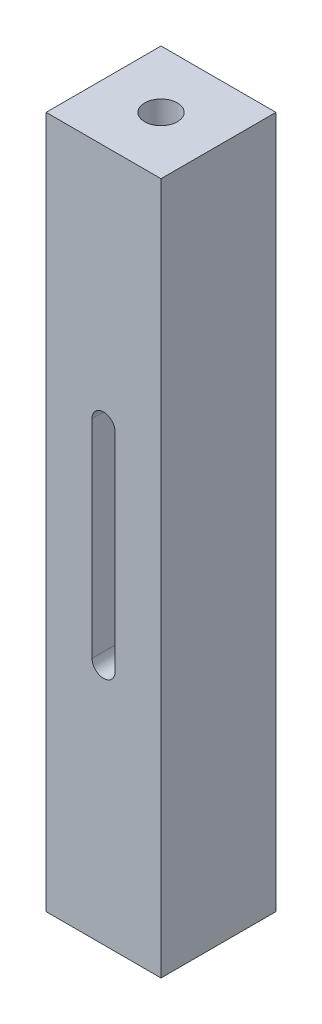
ISO-10303-21;
HEADER;
FILE_DESCRIPTION(('STEP AP214'),'2;1');
FILE_NAME('part.step','',(''),(''),'','','');
FILE_SCHEMA(('AUTOMOTIVE_DESIGN { 1 0 10303 214 1 1 1 1 }'));
ENDSEC;
DATA;
#1=APPLICATION_CONTEXT('core data for automotive mechanical design processes');
#2=APPLICATION_PROTOCOL_DEFINITION('international standard','automotive_design',2000,#1);
#3=PRODUCT_CONTEXT('',#1,'mechanical');
#4=PRODUCT('Part','Part','',(#3));
#5=PRODUCT_RELATED_PRODUCT_CATEGORY('part','',(#4));
#6=PRODUCT_DEFINITION_FORMATION('','',#4);
#7=PRODUCT_DEFINITION_CONTEXT('part definition',#1,'design');
#8=PRODUCT_DEFINITION('design','',#6,#7);
#9=PRODUCT_DEFINITION_SHAPE('','',#8);
#10=(LENGTH_UNIT() NAMED_UNIT(*) SI_UNIT(.MILLI.,.METRE.));
#11=(NAMED_UNIT(*) PLANE_ANGLE_UNIT() SI_UNIT($,.RADIAN.));
#12=(NAMED_UNIT(*) SI_UNIT($,.STERADIAN.) SOLID_ANGLE_UNIT());
#13=UNCERTAINTY_MEASURE_WITH_UNIT(LENGTH_MEASURE(1.E-05),#10,'distance_accuracy_value','');
#14=(GEOMETRIC_REPRESENTATION_CONTEXT(3) GLOBAL_UNCERTAINTY_ASSIGNED_CONTEXT((#13)) GLOBAL_UNIT_ASSIGNED_CONTEXT((#10,
#11,#12)) REPRESENTATION_CONTEXT('',''));
#15=CARTESIAN_POINT('',(0.,0.,0.));
#16=DIRECTION('',(0.,0.,1.));
#17=DIRECTION('',(1.,0.,0.));
#18=AXIS2_PLACEMENT_3D('',#15,#16,#17);
#19=CARTESIAN_POINT('',(0.,150.,0.));
#20=DIRECTION('',(0.,0.,-1.));
#21=DIRECTION('',(-1.,0.,0.));
#22=AXIS2_PLACEMENT_3D('',#19,#20,#21);
#23=PLANE('',#22);
#24=DIRECTION('',(1.,0.,0.));
#25=VECTOR('',#24,1.);
#26=CARTESIAN_POINT('',(0.,0.,0.));
#27=LINE('',#26,#25);
#28=CARTESIAN_POINT('',(-24.9,0.,0.));
#29=VERTEX_POINT('',#28);
#30=CARTESIAN_POINT('',(0.,0.,0.));
#31=VERTEX_POINT('',#30);
#32=EDGE_CURVE('E204',#29,#31,#27,.T.);
#33=ORIENTED_EDGE('',*,*,#32,.T.);
#34=DIRECTION('',(0.,-1.,0.));
#35=VECTOR('',#34,1.);
#36=CARTESIAN_POINT('',(0.,150.,0.));
#37=LINE('',#36,#35);
#38=CARTESIAN_POINT('',(0.,150.,0.));
#39=VERTEX_POINT('',#38);
#40=EDGE_CURVE('E213',#39,#31,#37,.T.);
#41=ORIENTED_EDGE('',*,*,#40,.F.);
#42=DIRECTION('',(1.,0.,0.));
#43=VECTOR('',#42,1.);
#44=CARTESIAN_POINT('',(0.,150.,0.));
#45=LINE('',#44,#43);
#46=CARTESIAN_POINT('',(-24.9,150.,0.));
#47=VERTEX_POINT('',#46);
#48=EDGE_CURVE('E217',#47,#39,#45,.T.);
#49=ORIENTED_EDGE('',*,*,#48,.F.);
#50=DIRECTION('',(0.,-1.,0.));
#51=VECTOR('',#50,1.);
#52=CARTESIAN_POINT('',(-24.9,150.,0.));
#53=LINE('',#52,#51);
#54=EDGE_CURVE('E201',#47,#29,#53,.T.);
#55=ORIENTED_EDGE('',*,*,#54,.T.);
#56=EDGE_LOOP('',(#33,#41,#49,#55));
#57=FACE_BOUND('',#56,.T.);
#58=CARTESIAN_POINT('',(-12.45,52.5,0.));
#59=DIRECTION('',(0.,0.,1.));
#60=DIRECTION('',(1.,0.,0.));
#61=AXIS2_PLACEMENT_3D('',#58,#59,#60);
#62=CIRCLE('',#61,2.5);
#63=CARTESIAN_POINT('',(-14.95,52.5,0.));
#64=VERTEX_POINT('',#63);
#65=CARTESIAN_POINT('',(-9.95,52.5,0.));
#66=VERTEX_POINT('',#65);
#67=EDGE_CURVE('E125',#64,#66,#62,.T.);
#68=ORIENTED_EDGE('',*,*,#67,.F.);
#69=DIRECTION('',(0.,-1.,0.));
#70=VECTOR('',#69,1.);
#71=CARTESIAN_POINT('',(-14.95,97.5,0.));
#72=LINE('',#71,#70);
#73=CARTESIAN_POINT('',(-14.95,97.5,0.));
#74=VERTEX_POINT('',#73);
#75=EDGE_CURVE('E261',#74,#64,#72,.T.);
#76=ORIENTED_EDGE('',*,*,#75,.F.);
#77=CARTESIAN_POINT('',(-12.45,97.5,0.));
#78=DIRECTION('',(0.,0.,-1.));
#79=DIRECTION('',(-1.,0.,0.));
#80=AXIS2_PLACEMENT_3D('',#77,#78,#79);
#81=CIRCLE('',#80,2.5);
#82=CARTESIAN_POINT('',(-9.95,97.5,0.));
#83=VERTEX_POINT('',#82);
#84=EDGE_CURVE('E156',#74,#83,#81,.T.);
#85=ORIENTED_EDGE('',*,*,#84,.T.);
#86=DIRECTION('',(0.,-1.,0.));
#87=VECTOR('',#86,1.);
#88=CARTESIAN_POINT('',(-9.95,97.5,0.));
#89=LINE('',#88,#87);
#90=EDGE_CURVE('E59',#83,#66,#89,.T.);
#91=ORIENTED_EDGE('',*,*,#90,.T.);
#92=EDGE_LOOP('',(#68,#76,#85,#91));
#93=FACE_BOUND('',#92,.T.);
#94=ADVANCED_FACE('F43',(#57,#93),#23,.F.);
#95=CARTESIAN_POINT('',(0.,150.,0.));
#96=DIRECTION('',(0.,1.,0.));
#97=DIRECTION('',(0.,0.,1.));
#98=AXIS2_PLACEMENT_3D('',#95,#96,#97);
#99=PLANE('',#98);
#100=DIRECTION('',(0.,0.,-1.));
#101=VECTOR('',#100,1.);
#102=CARTESIAN_POINT('',(0.,150.,0.));
#103=LINE('',#102,#101);
#104=CARTESIAN_POINT('',(0.,150.,-24.9));
#105=VERTEX_POINT('',#104);
#106=EDGE_CURVE('E209',#39,#105,#103,.T.);
#107=ORIENTED_EDGE('',*,*,#106,.T.);
#108=DIRECTION('',(-1.,0.,0.));
#109=VECTOR('',#108,1.);
#110=CARTESIAN_POINT('',(0.,150.,-24.9));
#111=LINE('',#110,#109);
#112=CARTESIAN_POINT('',(-24.9,150.,-24.9));
#113=VERTEX_POINT('',#112);
#114=EDGE_CURVE('E229',#105,#113,#111,.T.);
#115=ORIENTED_EDGE('',*,*,#114,.T.);
#116=DIRECTION('',(0.,0.,1.));
#117=VECTOR('',#116,1.);
#118=CARTESIAN_POINT('',(-24.9,150.,0.));
#119=LINE('',#118,#117);
#120=EDGE_CURVE('E199',#113,#47,#119,.T.);
#121=ORIENTED_EDGE('',*,*,#120,.T.);
#122=ORIENTED_EDGE('',*,*,#48,.T.);
#123=EDGE_LOOP('',(#107,#115,#121,#122));
#124=FACE_BOUND('',#123,.T.);
#125=CARTESIAN_POINT('',(-12.45,150.,-12.45));
#126=DIRECTION('',(0.,1.,0.));
#127=DIRECTION('',(0.,0.,1.));
#128=AXIS2_PLACEMENT_3D('',#125,#126,#127);
#129=CIRCLE('',#128,3.55);
#130=CARTESIAN_POINT('',(-12.45,150.,-8.9));
#131=VERTEX_POINT('',#130);
#132=EDGE_CURVE('E233',#131,#131,#129,.T.);
#133=ORIENTED_EDGE('',*,*,#132,.F.);
#134=EDGE_LOOP('',(#133));
#135=FACE_BOUND('',#134,.T.);
#136=ADVANCED_FACE('F165',(#124,#135),#99,.T.);
#137=CARTESIAN_POINT('',(0.,0.,0.));
#138=DIRECTION('',(0.,1.,0.));
#139=DIRECTION('',(0.,0.,1.));
#140=AXIS2_PLACEMENT_3D('',#137,#138,#139);
#141=PLANE('',#140);
#142=DIRECTION('',(0.,0.,-1.));
#143=VECTOR('',#142,1.);
#144=CARTESIAN_POINT('',(0.,0.,0.));
#145=LINE('',#144,#143);
#146=CARTESIAN_POINT('',(0.,0.,-24.9));
#147=VERTEX_POINT('',#146);
#148=EDGE_CURVE('E195',#31,#147,#145,.T.);
#149=ORIENTED_EDGE('',*,*,#148,.F.);
#150=ORIENTED_EDGE('',*,*,#32,.F.);
#151=DIRECTION('',(0.,0.,1.));
#152=VECTOR('',#151,1.);
#153=CARTESIAN_POINT('',(-24.9,0.,0.));
#154=LINE('',#153,#152);
#155=CARTESIAN_POINT('',(-24.9,0.,-24.9));
#156=VERTEX_POINT('',#155);
#157=EDGE_CURVE('E194',#156,#29,#154,.T.);
#158=ORIENTED_EDGE('',*,*,#157,.F.);
#159=DIRECTION('',(-1.,0.,0.));
#160=VECTOR('',#159,1.);
#161=CARTESIAN_POINT('',(0.,0.,-24.9));
#162=LINE('',#161,#160);
#163=EDGE_CURVE('E186',#147,#156,#162,.T.);
#164=ORIENTED_EDGE('',*,*,#163,.F.);
#165=EDGE_LOOP('',(#149,#150,#158,#164));
#166=FACE_BOUND('',#165,.T.);
#167=CARTESIAN_POINT('',(-12.45,0.,-12.45));
#168=DIRECTION('',(0.,1.,0.));
#169=DIRECTION('',(0.,0.,1.));
#170=AXIS2_PLACEMENT_3D('',#167,#168,#169);
#171=CIRCLE('',#170,3.55);
#172=CARTESIAN_POINT('',(-12.45,0.,-8.9));
#173=VERTEX_POINT('',#172);
#174=EDGE_CURVE('E237',#173,#173,#171,.T.);
#175=ORIENTED_EDGE('',*,*,#174,.T.);
#176=EDGE_LOOP('',(#175));
#177=FACE_BOUND('',#176,.T.);
#178=ADVANCED_FACE('F168',(#166,#177),#141,.F.);
#179=CARTESIAN_POINT('',(0.,150.,0.));
#180=DIRECTION('',(-1.,0.,0.));
#181=DIRECTION('',(0.,0.,1.));
#182=AXIS2_PLACEMENT_3D('',#179,#180,#181);
#183=PLANE('',#182);
#184=ORIENTED_EDGE('',*,*,#148,.T.);
#185=DIRECTION('',(0.,-1.,0.));
#186=VECTOR('',#185,1.);
#187=CARTESIAN_POINT('',(0.,150.,-24.9));
#188=LINE('',#187,#186);
#189=EDGE_CURVE('E11',#105,#147,#188,.T.);
#190=ORIENTED_EDGE('',*,*,#189,.F.);
#191=ORIENTED_EDGE('',*,*,#106,.F.);
#192=ORIENTED_EDGE('',*,*,#40,.T.);
#193=EDGE_LOOP('',(#184,#190,#191,#192));
#194=FACE_BOUND('',#193,.T.);
#195=ADVANCED_FACE('F45',(#194),#183,.F.);
#196=CARTESIAN_POINT('',(0.,150.,-24.9));
#197=DIRECTION('',(0.,0.,1.));
#198=DIRECTION('',(1.,0.,0.));
#199=AXIS2_PLACEMENT_3D('',#196,#197,#198);
#200=PLANE('',#199);
#201=ORIENTED_EDGE('',*,*,#163,.T.);
#202=DIRECTION('',(0.,-1.,0.));
#203=VECTOR('',#202,1.);
#204=CARTESIAN_POINT('',(-24.9,150.,-24.9));
#205=LINE('',#204,#203);
#206=EDGE_CURVE('E52',#113,#156,#205,.T.);
#207=ORIENTED_EDGE('',*,*,#206,.F.);
#208=ORIENTED_EDGE('',*,*,#114,.F.);
#209=ORIENTED_EDGE('',*,*,#189,.T.);
#210=EDGE_LOOP('',(#201,#207,#208,#209));
#211=FACE_BOUND('',#210,.T.);
#212=ADVANCED_FACE('F177',(#211),#200,.F.);
#213=CARTESIAN_POINT('',(-24.9,150.,0.));
#214=DIRECTION('',(1.,0.,0.));
#215=DIRECTION('',(0.,0.,-1.));
#216=AXIS2_PLACEMENT_3D('',#213,#214,#215);
#217=PLANE('',#216);
#218=ORIENTED_EDGE('',*,*,#157,.T.);
#219=ORIENTED_EDGE('',*,*,#54,.F.);
#220=ORIENTED_EDGE('',*,*,#120,.F.);
#221=ORIENTED_EDGE('',*,*,#206,.T.);
#222=EDGE_LOOP('',(#218,#219,#220,#221));
#223=FACE_BOUND('',#222,.T.);
#224=ADVANCED_FACE('F164',(#223),#217,.F.);
#225=CARTESIAN_POINT('',(-12.45,150.,-12.45));
#226=DIRECTION('',(0.,-1.,0.));
#227=DIRECTION('',(0.,0.,-1.));
#228=AXIS2_PLACEMENT_3D('',#225,#226,#227);
#229=CYLINDRICAL_SURFACE('',#228,3.55);
#230=DIRECTION('',(0.,-1.,0.));
#231=VECTOR('',#230,1.);
#232=CARTESIAN_POINT('',(-14.95,150.,-9.92958336777428));
#233=LINE('',#232,#231);
#234=CARTESIAN_POINT('',(-14.95,97.5,-9.92958336777428));
#235=VERTEX_POINT('',#234);
#236=CARTESIAN_POINT('',(-14.95,52.5,-9.92958336777428));
#237=VERTEX_POINT('',#236);
#238=EDGE_CURVE('E132',#235,#237,#233,.T.);
#239=ORIENTED_EDGE('',*,*,#238,.T.);
#240=CARTESIAN_POINT('',(-14.95,52.5,-9.92958336777428));
#241=CARTESIAN_POINT('',(-14.9500172955895,52.4396410473149,-9.92962243143256));
#242=CARTESIAN_POINT('',(-14.9478148936106,52.3793074114605,-9.92741616371839));
#243=CARTESIAN_POINT('',(-14.9391109248143,52.2593465395515,-9.91881585708524));
#244=CARTESIAN_POINT('',(-14.9326163278174,52.1997183175408,-9.91242860755494));
#245=CARTESIAN_POINT('',(-14.9155625657586,52.0822803468996,-9.89585990559607));
#246=CARTESIAN_POINT('',(-14.9050493210102,52.024457759607,-9.88572135898051));
#247=CARTESIAN_POINT('',(-14.8801672617943,51.9103385314542,-9.86212773492245));
#248=CARTESIAN_POINT('',(-14.8657970534636,51.8540424503702,-9.84867145863325));
#249=CARTESIAN_POINT('',(-14.8174435364751,51.6886181915408,-9.80432240452607));
#250=CARTESIAN_POINT('',(-14.7780907875172,51.5821178372995,-9.76931772380717));
#251=CARTESIAN_POINT('',(-14.6865222308671,51.3772184560647,-9.69245572583047));
#252=CARTESIAN_POINT('',(-14.6342652832461,51.2788467094263,-9.65057663827893));
#253=CARTESIAN_POINT('',(-14.507716043449,51.0742740673846,-9.555939942336));
#254=CARTESIAN_POINT('',(-14.4311630782887,50.9697510187705,-9.50256620542888));
#255=CARTESIAN_POINT('',(-14.2628210466401,50.7736119902543,-9.39612689485723));
#256=CARTESIAN_POINT('',(-14.1710237429709,50.6820030381513,-9.34306150393759));
#257=CARTESIAN_POINT('',(-13.9558815326285,50.4986317582468,-9.23258729267795));
#258=CARTESIAN_POINT('',(-13.8298265366432,50.4094854829168,-9.17597130499123));
#259=CARTESIAN_POINT('',(-13.6275400937733,50.2933166170076,-9.10020746085601));
#260=CARTESIAN_POINT('',(-13.5579250556764,50.2575238711768,-9.07648316223));
#261=CARTESIAN_POINT('',(-13.4146843393017,50.1922793970561,-9.03276648889678));
#262=CARTESIAN_POINT('',(-13.3410604552212,50.1628248607987,-9.01277246212059));
#263=CARTESIAN_POINT('',(-13.1560298548026,50.0989686204796,-8.96909763198269));
#264=CARTESIAN_POINT('',(-13.0426653642865,50.0684073667012,-8.94787435142497));
#265=CARTESIAN_POINT('',(-12.8113592967104,50.0234527656321,-8.91651359543244));
#266=CARTESIAN_POINT('',(-12.6934215501939,50.0090461774641,-8.90636704134137));
#267=CARTESIAN_POINT('',(-12.456016023374,49.9971796063026,-8.89801593705122));
#268=CARTESIAN_POINT('',(-12.3365456588244,49.9997535087723,-8.89983526537855));
#269=CARTESIAN_POINT('',(-12.0999488378241,50.0217765802728,-8.91531027909572));
#270=CARTESIAN_POINT('',(-11.9828230461075,50.041230467691,-8.92896927397398));
#271=CARTESIAN_POINT('',(-11.7569003788532,50.0952558448953,-8.96647756250765));
#272=CARTESIAN_POINT('',(-11.6479717814065,50.1294574551676,-8.99007722444064));
#273=CARTESIAN_POINT('',(-11.4376472255329,50.2113557469459,-9.04566596087549));
#274=CARTESIAN_POINT('',(-11.3362526935516,50.2590549758155,-9.07765661890058));
#275=CARTESIAN_POINT('',(-11.1315309103145,50.3723664359245,-9.15192685022707));
#276=CARTESIAN_POINT('',(-11.0292603970579,50.4393870395104,-9.19495768785188));
#277=CARTESIAN_POINT('',(-10.8367966018301,50.5862966780128,-9.28591543120471));
#278=CARTESIAN_POINT('',(-10.7466162819656,50.6661993250843,-9.33384749613069));
#279=CARTESIAN_POINT('',(-10.5639298780979,50.8529539629837,-9.44029580443247));
#280=CARTESIAN_POINT('',(-10.4739338385023,50.9620675740698,-9.49916268562961));
#281=CARTESIAN_POINT('',(-10.3128604447879,51.1951276962468,-9.61364985150114));
#282=CARTESIAN_POINT('',(-10.2417840823167,51.3190749843302,-9.66926996588166));
#283=CARTESIAN_POINT('',(-10.134535613703,51.5508046579356,-9.75837847751746));
#284=CARTESIAN_POINT('',(-10.0940970843391,51.6557773097046,-9.79401730693604));
#285=CARTESIAN_POINT('',(-10.0273213578474,51.8727747938097,-9.85477729382108));
#286=CARTESIAN_POINT('',(-10.0009292990344,51.9847702509084,-9.87993928582028));
#287=CARTESIAN_POINT('',(-9.97169067267033,52.1647273551852,-9.9082078029388));
#288=CARTESIAN_POINT('',(-9.96360307675327,52.2311144232213,-9.91614376063475));
#289=CARTESIAN_POINT('',(-9.95273783589632,52.3649767538164,-9.92686683735443));
#290=CARTESIAN_POINT('',(-9.9499800028894,52.4324551398959,-9.92963474428004));
#291=CARTESIAN_POINT('',(-9.95,52.5,-9.92958336777428));
#292=B_SPLINE_CURVE_WITH_KNOTS('',3,(#240,#241,#242,#243,#244,#245,#246,#247,#248,#249,#250,
#251,#252,#253,#254,#255,#256,#257,#258,#259,#260,#261,#262,#263,#264,#265,#266,#267,#268,#269,
#270,#271,#272,#273,#274,#275,#276,#277,#278,#279,#280,#281,#282,#283,#284,#285,#286,#287,#288,
#289,#290,#291),.UNSPECIFIED.,.F.,.F.,(4,2,2,2,2,2,2,2,2,2,2,2,2,2,2,2,2,2,2,2,2,2,2,2,2,4),(0.,
0.180955696338622,0.361618269933722,0.540275342640234,0.71899706713246,1.07390598770652,
1.42996134325616,1.84879675566998,2.2678592239332,2.75808963516233,3.00311204522661,
3.24802568041549,3.60430312175796,3.960288332853,4.31698414576527,4.67377969640884,
5.02210439434048,5.37049487440307,5.75792703730426,6.14577130678903,6.6035155000332,
7.0612836805595,7.41409254239013,7.765513124328,7.96717046646382,8.16957598348976),.UNSPECIFIED.);
#293=CARTESIAN_POINT('',(-9.95,52.5,-9.92958336777428));
#294=VERTEX_POINT('',#293);
#295=EDGE_CURVE('E119',#237,#294,#292,.T.);
#296=ORIENTED_EDGE('',*,*,#295,.T.);
#297=DIRECTION('',(0.,-1.,0.));
#298=VECTOR('',#297,1.);
#299=CARTESIAN_POINT('',(-9.95,150.,-9.92958336777428));
#300=LINE('',#299,#298);
#301=CARTESIAN_POINT('',(-9.95,97.5,-9.92958336777428));
#302=VERTEX_POINT('',#301);
#303=EDGE_CURVE('E108',#302,#294,#300,.T.);
#304=ORIENTED_EDGE('',*,*,#303,.F.);
#305=CARTESIAN_POINT('',(-14.95,97.5,-9.92958336777428));
#306=CARTESIAN_POINT('',(-14.9500172955895,97.5603589526851,-9.92962243143256));
#307=CARTESIAN_POINT('',(-14.9478148936106,97.6206925885395,-9.92741616371839));
#308=CARTESIAN_POINT('',(-14.9391109248143,97.7406534604485,-9.91881585708524));
#309=CARTESIAN_POINT('',(-14.9326163278174,97.8002816824591,-9.91242860755495));
#310=CARTESIAN_POINT('',(-14.9155625657586,97.9177196531004,-9.89585990559608));
#311=CARTESIAN_POINT('',(-14.9050493210102,97.9755422403929,-9.88572135898052));
#312=CARTESIAN_POINT('',(-14.8801672617943,98.0896614685457,-9.86212773492245));
#313=CARTESIAN_POINT('',(-14.8657970534636,98.1459575496298,-9.84867145863326));
#314=CARTESIAN_POINT('',(-14.8174435364751,98.3113818084591,-9.80432240452607));
#315=CARTESIAN_POINT('',(-14.7780907875172,98.4178821627005,-9.76931772380718));
#316=CARTESIAN_POINT('',(-14.6865222308671,98.6227815439353,-9.69245572583048));
#317=CARTESIAN_POINT('',(-14.6342652832461,98.7211532905737,-9.65057663827894));
#318=CARTESIAN_POINT('',(-14.507716043449,98.9257259326154,-9.55593994233601));
#319=CARTESIAN_POINT('',(-14.4311630782887,99.0302489812294,-9.50256620542888));
#320=CARTESIAN_POINT('',(-14.2628210466401,99.2263880097457,-9.39612689485724));
#321=CARTESIAN_POINT('',(-14.1710237429709,99.3179969618487,-9.3430615039376));
#322=CARTESIAN_POINT('',(-13.9558815326285,99.5013682417532,-9.23258729267796));
#323=CARTESIAN_POINT('',(-13.8298265366432,99.5905145170832,-9.17597130499124));
#324=CARTESIAN_POINT('',(-13.6275400937734,99.7066833829924,-9.10020746085602));
#325=CARTESIAN_POINT('',(-13.5579250556764,99.7424761288232,-9.07648316223001));
#326=CARTESIAN_POINT('',(-13.4146843393017,99.8077206029439,-9.03276648889679));
#327=CARTESIAN_POINT('',(-13.3410604552212,99.8371751392012,-9.01277246212059));
#328=CARTESIAN_POINT('',(-13.1560298548026,99.9010313795204,-8.9690976319827));
#329=CARTESIAN_POINT('',(-13.0426653642865,99.9315926332988,-8.94787435142497));
#330=CARTESIAN_POINT('',(-12.8113592967105,99.9765472343679,-8.91651359543244));
#331=CARTESIAN_POINT('',(-12.6934215501939,99.9909538225359,-8.90636704134138));
#332=CARTESIAN_POINT('',(-12.456016023374,100.002820393697,-8.89801593705122));
#333=CARTESIAN_POINT('',(-12.3365456588245,100.000246491228,-8.89983526537855));
#334=CARTESIAN_POINT('',(-12.0999488378241,99.9782234197272,-8.91531027909572));
#335=CARTESIAN_POINT('',(-11.9828230461075,99.958769532309,-8.92896927397398));
#336=CARTESIAN_POINT('',(-11.7569003788532,99.9047441551047,-8.96647756250765));
#337=CARTESIAN_POINT('',(-11.6479717814066,99.8705425448324,-8.99007722444064));
#338=CARTESIAN_POINT('',(-11.4376472255329,99.7886442530541,-9.04566596087548));
#339=CARTESIAN_POINT('',(-11.3362526935516,99.7409450241845,-9.07765661890057));
#340=CARTESIAN_POINT('',(-11.1315309103145,99.6276335640756,-9.15192685022706));
#341=CARTESIAN_POINT('',(-11.029260397058,99.5606129604896,-9.19495768785187));
#342=CARTESIAN_POINT('',(-10.8367966018302,99.4137033219872,-9.2859154312047));
#343=CARTESIAN_POINT('',(-10.7466162819657,99.3338006749157,-9.33384749613068));
#344=CARTESIAN_POINT('',(-10.5639298780979,99.1470460370163,-9.44029580443245));
#345=CARTESIAN_POINT('',(-10.4739338385023,99.0379324259303,-9.4991626856296));
#346=CARTESIAN_POINT('',(-10.3128604447879,98.8048723037533,-9.61364985150112));
#347=CARTESIAN_POINT('',(-10.2417840823167,98.6809250156699,-9.66926996588165));
#348=CARTESIAN_POINT('',(-10.134535613703,98.4491953420644,-9.75837847751745));
#349=CARTESIAN_POINT('',(-10.0940970843391,98.3442226902955,-9.79401730693603));
#350=CARTESIAN_POINT('',(-10.0273213578475,98.1272252061903,-9.85477729382108));
#351=CARTESIAN_POINT('',(-10.0009292990344,98.0152297490916,-9.87993928582027));
#352=CARTESIAN_POINT('',(-9.97169067267033,97.8352726448148,-9.9082078029388));
#353=CARTESIAN_POINT('',(-9.96360307675327,97.7688855767787,-9.91614376063475));
#354=CARTESIAN_POINT('',(-9.95273783589632,97.6350232461836,-9.92686683735443));
#355=CARTESIAN_POINT('',(-9.9499800028894,97.5675448601041,-9.92963474428004));
#356=CARTESIAN_POINT('',(-9.95,97.5,-9.92958336777428));
#357=B_SPLINE_CURVE_WITH_KNOTS('',3,(#305,#306,#307,#308,#309,#310,#311,#312,#313,#314,#315,
#316,#317,#318,#319,#320,#321,#322,#323,#324,#325,#326,#327,#328,#329,#330,#331,#332,#333,#334,
#335,#336,#337,#338,#339,#340,#341,#342,#343,#344,#345,#346,#347,#348,#349,#350,#351,#352,#353,
#354,#355,#356),.UNSPECIFIED.,.F.,.F.,(4,2,2,2,2,2,2,2,2,2,2,2,2,2,2,2,2,2,2,2,2,2,2,2,2,4),(0.,
0.180955696338622,0.361618269933707,0.54027534264022,0.718997067132452,1.07390598770652,
1.42996134325616,1.84879675566998,2.26785922393318,2.75808963516231,3.00311204522659,
3.24802568041547,3.60430312175793,3.96028833285297,4.31698414576524,4.67377969640882,
5.02210439434046,5.37049487440304,5.75792703730424,6.145771306789,6.60351550003319,
7.06128368055947,7.41409254239013,7.765513124328,7.96717046646383,8.16957598348978),.UNSPECIFIED.);
#358=EDGE_CURVE('E118',#235,#302,#357,.T.);
#359=ORIENTED_EDGE('',*,*,#358,.F.);
#360=EDGE_LOOP('',(#239,#296,#304,#359));
#361=FACE_BOUND('',#360,.T.);
#362=ORIENTED_EDGE('',*,*,#132,.T.);
#363=EDGE_LOOP('',(#362));
#364=FACE_BOUND('',#363,.T.);
#365=ORIENTED_EDGE('',*,*,#174,.F.);
#366=EDGE_LOOP('',(#365));
#367=FACE_BOUND('',#366,.T.);
#368=ADVANCED_FACE('F130',(#361,#364,#367),#229,.F.);
#369=CARTESIAN_POINT('',(-14.95,97.5,-24.901));
#370=DIRECTION('',(-1.,0.,0.));
#371=DIRECTION('',(0.,0.,1.));
#372=AXIS2_PLACEMENT_3D('',#369,#370,#371);
#373=PLANE('',#372);
#374=DIRECTION('',(0.,0.,1.));
#375=VECTOR('',#374,1.);
#376=CARTESIAN_POINT('',(-14.95,97.5,-24.901));
#377=LINE('',#376,#375);
#378=EDGE_CURVE('E67',#235,#74,#377,.T.);
#379=ORIENTED_EDGE('',*,*,#378,.T.);
#380=ORIENTED_EDGE('',*,*,#75,.T.);
#381=DIRECTION('',(0.,0.,1.));
#382=VECTOR('',#381,1.);
#383=CARTESIAN_POINT('',(-14.95,52.5,-24.901));
#384=LINE('',#383,#382);
#385=EDGE_CURVE('E127',#237,#64,#384,.T.);
#386=ORIENTED_EDGE('',*,*,#385,.F.);
#387=ORIENTED_EDGE('',*,*,#238,.F.);
#388=EDGE_LOOP('',(#379,#380,#386,#387));
#389=FACE_BOUND('',#388,.T.);
#390=ADVANCED_FACE('F147',(#389),#373,.F.);
#391=CARTESIAN_POINT('',(-12.45,52.5,-24.901));
#392=DIRECTION('',(0.,0.,1.));
#393=DIRECTION('',(1.,0.,0.));
#394=AXIS2_PLACEMENT_3D('',#391,#392,#393);
#395=CYLINDRICAL_SURFACE('',#394,2.5);
#396=ORIENTED_EDGE('',*,*,#385,.T.);
#397=ORIENTED_EDGE('',*,*,#67,.T.);
#398=DIRECTION('',(0.,0.,1.));
#399=VECTOR('',#398,1.);
#400=CARTESIAN_POINT('',(-9.95,52.5,-24.901));
#401=LINE('',#400,#399);
#402=EDGE_CURVE('E111',#294,#66,#401,.T.);
#403=ORIENTED_EDGE('',*,*,#402,.F.);
#404=ORIENTED_EDGE('',*,*,#295,.F.);
#405=EDGE_LOOP('',(#396,#397,#403,#404));
#406=FACE_BOUND('',#405,.T.);
#407=ADVANCED_FACE('F122',(#406),#395,.F.);
#408=CARTESIAN_POINT('',(-9.95,97.5,-24.901));
#409=DIRECTION('',(-1.,0.,0.));
#410=DIRECTION('',(0.,0.,1.));
#411=AXIS2_PLACEMENT_3D('',#408,#409,#410);
#412=PLANE('',#411);
#413=ORIENTED_EDGE('',*,*,#303,.T.);
#414=ORIENTED_EDGE('',*,*,#402,.T.);
#415=ORIENTED_EDGE('',*,*,#90,.F.);
#416=DIRECTION('',(0.,0.,1.));
#417=VECTOR('',#416,1.);
#418=CARTESIAN_POINT('',(-9.95,97.5,-24.901));
#419=LINE('',#418,#417);
#420=EDGE_CURVE('E113',#302,#83,#419,.T.);
#421=ORIENTED_EDGE('',*,*,#420,.F.);
#422=EDGE_LOOP('',(#413,#414,#415,#421));
#423=FACE_BOUND('',#422,.T.);
#424=ADVANCED_FACE('F110',(#423),#412,.T.);
#425=CARTESIAN_POINT('',(-12.45,97.5,-24.901));
#426=DIRECTION('',(0.,0.,1.));
#427=DIRECTION('',(1.,0.,0.));
#428=AXIS2_PLACEMENT_3D('',#425,#426,#427);
#429=CYLINDRICAL_SURFACE('',#428,2.5);
#430=ORIENTED_EDGE('',*,*,#358,.T.);
#431=ORIENTED_EDGE('',*,*,#420,.T.);
#432=ORIENTED_EDGE('',*,*,#84,.F.);
#433=ORIENTED_EDGE('',*,*,#378,.F.);
#434=EDGE_LOOP('',(#430,#431,#432,#433));
#435=FACE_BOUND('',#434,.T.);
#436=ADVANCED_FACE('F158',(#435),#429,.F.);
#437=CLOSED_SHELL('',(#94,#136,#178,#195,#212,#224,#368,#390,#407,#424,#436));
#438=MANIFOLD_SOLID_BREP('B2',#437);
#439=ADVANCED_BREP_SHAPE_REPRESENTATION('',(#18,#438),#14);
#440=SHAPE_DEFINITION_REPRESENTATION(#9,#439);
ENDSEC;
END-ISO-10303-21;
